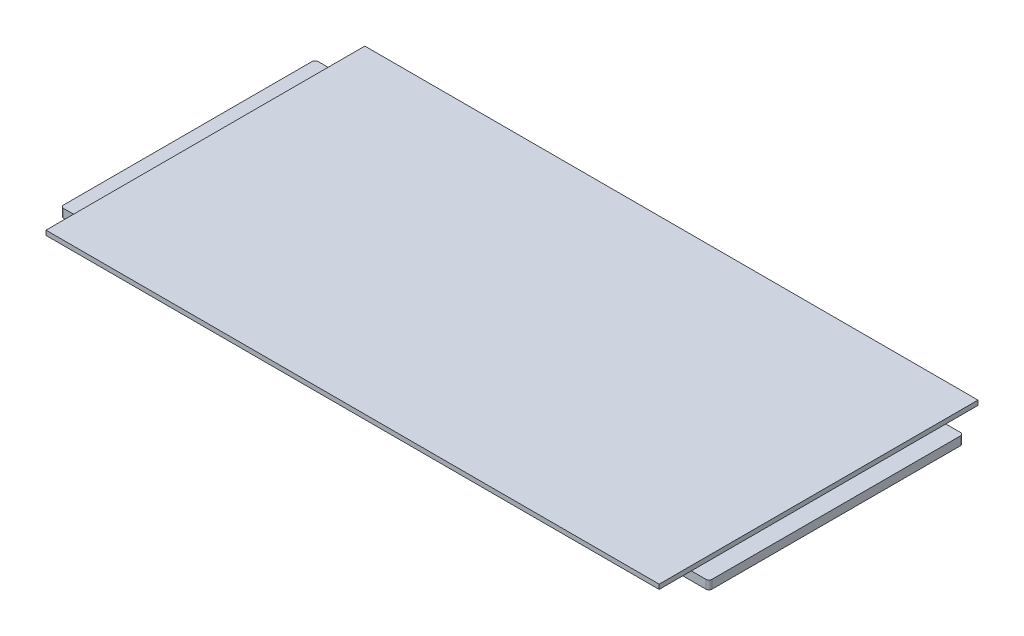
ISO-10303-21;
HEADER;
FILE_DESCRIPTION(('STEP AP214'),'2;1');
FILE_NAME('part.step','',(''),(''),'','','');
FILE_SCHEMA(('AUTOMOTIVE_DESIGN { 1 0 10303 214 1 1 1 1 }'));
ENDSEC;
DATA;
#1=APPLICATION_CONTEXT('core data for automotive mechanical design processes');
#2=APPLICATION_PROTOCOL_DEFINITION('international standard','automotive_design',2000,#1);
#3=PRODUCT_CONTEXT('',#1,'mechanical');
#4=PRODUCT('Part','Part','',(#3));
#5=PRODUCT_RELATED_PRODUCT_CATEGORY('part','',(#4));
#6=PRODUCT_DEFINITION_FORMATION('','',#4);
#7=PRODUCT_DEFINITION_CONTEXT('part definition',#1,'design');
#8=PRODUCT_DEFINITION('design','',#6,#7);
#9=PRODUCT_DEFINITION_SHAPE('','',#8);
#10=(LENGTH_UNIT() NAMED_UNIT(*) SI_UNIT(.MILLI.,.METRE.));
#11=(NAMED_UNIT(*) PLANE_ANGLE_UNIT() SI_UNIT($,.RADIAN.));
#12=(NAMED_UNIT(*) SI_UNIT($,.STERADIAN.) SOLID_ANGLE_UNIT());
#13=UNCERTAINTY_MEASURE_WITH_UNIT(LENGTH_MEASURE(1.E-05),#10,'distance_accuracy_value','');
#14=(GEOMETRIC_REPRESENTATION_CONTEXT(3) GLOBAL_UNCERTAINTY_ASSIGNED_CONTEXT((#13)) GLOBAL_UNIT_ASSIGNED_CONTEXT((#10,
#11,#12)) REPRESENTATION_CONTEXT('',''));
#15=CARTESIAN_POINT('',(0.,0.,0.));
#16=DIRECTION('',(0.,0.,1.));
#17=DIRECTION('',(1.,0.,0.));
#18=AXIS2_PLACEMENT_3D('',#15,#16,#17);
#19=CARTESIAN_POINT('',(0.,17.78,0.));
#20=DIRECTION('',(0.,1.,0.));
#21=DIRECTION('',(0.,0.,1.));
#22=AXIS2_PLACEMENT_3D('',#19,#20,#21);
#23=PLANE('',#22);
#24=DIRECTION('',(0.,0.,-1.));
#25=VECTOR('',#24,1.);
#26=CARTESIAN_POINT('',(635.,17.78,330.2));
#27=LINE('',#26,#25);
#28=CARTESIAN_POINT('',(635.,17.78,263.525));
#29=VERTEX_POINT('',#28);
#30=CARTESIAN_POINT('',(635.,17.78,-263.525));
#31=VERTEX_POINT('',#30);
#32=EDGE_CURVE('E11',#29,#31,#27,.T.);
#33=ORIENTED_EDGE('',*,*,#32,.F.);
#34=DIRECTION('',(1.,0.,0.));
#35=VECTOR('',#34,1.);
#36=CARTESIAN_POINT('',(-671.5125,17.78,263.525));
#37=LINE('',#36,#35);
#38=CARTESIAN_POINT('',(665.1625,17.78,263.525));
#39=VERTEX_POINT('',#38);
#40=EDGE_CURVE('E209',#29,#39,#37,.T.);
#41=ORIENTED_EDGE('',*,*,#40,.T.);
#42=CARTESIAN_POINT('',(665.1625,17.78,257.175));
#43=DIRECTION('',(0.,1.,0.));
#44=DIRECTION('',(0.,0.,1.));
#45=AXIS2_PLACEMENT_3D('',#42,#43,#44);
#46=CIRCLE('',#45,6.35);
#47=CARTESIAN_POINT('',(671.5125,17.78,257.175));
#48=VERTEX_POINT('',#47);
#49=EDGE_CURVE('E242',#39,#48,#46,.T.);
#50=ORIENTED_EDGE('',*,*,#49,.T.);
#51=DIRECTION('',(0.,0.,-1.));
#52=VECTOR('',#51,1.);
#53=CARTESIAN_POINT('',(671.5125,17.78,-263.525));
#54=LINE('',#53,#52);
#55=CARTESIAN_POINT('',(671.5125,17.78,-257.175));
#56=VERTEX_POINT('',#55);
#57=EDGE_CURVE('E199',#48,#56,#54,.T.);
#58=ORIENTED_EDGE('',*,*,#57,.T.);
#59=CARTESIAN_POINT('',(665.1625,17.78,-257.175));
#60=DIRECTION('',(0.,1.,0.));
#61=DIRECTION('',(0.,0.,1.));
#62=AXIS2_PLACEMENT_3D('',#59,#60,#61);
#63=CIRCLE('',#62,6.35);
#64=CARTESIAN_POINT('',(665.1625,17.78,-263.525));
#65=VERTEX_POINT('',#64);
#66=EDGE_CURVE('E244',#56,#65,#63,.T.);
#67=ORIENTED_EDGE('',*,*,#66,.T.);
#68=DIRECTION('',(-1.,0.,0.));
#69=VECTOR('',#68,1.);
#70=CARTESIAN_POINT('',(-671.5125,17.78,-263.525));
#71=LINE('',#70,#69);
#72=EDGE_CURVE('E204',#65,#31,#71,.T.);
#73=ORIENTED_EDGE('',*,*,#72,.T.);
#74=EDGE_LOOP('',(#33,#41,#50,#58,#67,#73));
#75=FACE_BOUND('',#74,.T.);
#76=ADVANCED_FACE('F33',(#75),#23,.T.);
#77=CARTESIAN_POINT('',(671.5125,17.78,-263.525));
#78=DIRECTION('',(-1.,0.,0.));
#79=DIRECTION('',(0.,0.,1.));
#80=AXIS2_PLACEMENT_3D('',#77,#78,#79);
#81=PLANE('',#80);
#82=DIRECTION('',(0.,0.,-1.));
#83=VECTOR('',#82,1.);
#84=CARTESIAN_POINT('',(671.5125,0.,-263.525));
#85=LINE('',#84,#83);
#86=CARTESIAN_POINT('',(671.5125,0.,257.175));
#87=VERTEX_POINT('',#86);
#88=CARTESIAN_POINT('',(671.5125,0.,-257.175));
#89=VERTEX_POINT('',#88);
#90=EDGE_CURVE('E198',#87,#89,#85,.T.);
#91=ORIENTED_EDGE('',*,*,#90,.T.);
#92=DIRECTION('',(0.,-1.,0.));
#93=VECTOR('',#92,1.);
#94=CARTESIAN_POINT('',(671.5125,17.78,-257.175));
#95=LINE('',#94,#93);
#96=EDGE_CURVE('E37',#89,#56,#95,.F.);
#97=ORIENTED_EDGE('',*,*,#96,.T.);
#98=ORIENTED_EDGE('',*,*,#57,.F.);
#99=DIRECTION('',(0.,-1.,0.));
#100=VECTOR('',#99,1.);
#101=CARTESIAN_POINT('',(671.5125,17.78,257.175));
#102=LINE('',#101,#100);
#103=EDGE_CURVE('E255',#48,#87,#102,.T.);
#104=ORIENTED_EDGE('',*,*,#103,.T.);
#105=EDGE_LOOP('',(#91,#97,#98,#104));
#106=FACE_BOUND('',#105,.T.);
#107=ADVANCED_FACE('F298',(#106),#81,.F.);
#108=CARTESIAN_POINT('',(-671.5125,17.78,-263.525));
#109=DIRECTION('',(0.,0.,1.));
#110=DIRECTION('',(1.,0.,0.));
#111=AXIS2_PLACEMENT_3D('',#108,#109,#110);
#112=PLANE('',#111);
#113=DIRECTION('',(-1.,0.,0.));
#114=VECTOR('',#113,1.);
#115=CARTESIAN_POINT('',(-671.5125,0.,-263.525));
#116=LINE('',#115,#114);
#117=CARTESIAN_POINT('',(665.1625,0.,-263.525));
#118=VERTEX_POINT('',#117);
#119=CARTESIAN_POINT('',(-665.1625,0.,-263.525));
#120=VERTEX_POINT('',#119);
#121=EDGE_CURVE('E216',#118,#120,#116,.T.);
#122=ORIENTED_EDGE('',*,*,#121,.T.);
#123=DIRECTION('',(0.,-1.,0.));
#124=VECTOR('',#123,1.);
#125=CARTESIAN_POINT('',(-665.1625,17.78,-263.525));
#126=LINE('',#125,#124);
#127=CARTESIAN_POINT('',(-665.1625,17.78,-263.525));
#128=VERTEX_POINT('',#127);
#129=EDGE_CURVE('E253',#120,#128,#126,.F.);
#130=ORIENTED_EDGE('',*,*,#129,.T.);
#131=CARTESIAN_POINT('',(-635.,17.78,-263.525));
#132=VERTEX_POINT('',#131);
#133=EDGE_CURVE('E202',#132,#128,#71,.T.);
#134=ORIENTED_EDGE('',*,*,#133,.F.);
#135=EDGE_CURVE('E58',#31,#132,#71,.T.);
#136=ORIENTED_EDGE('',*,*,#135,.F.);
#137=ORIENTED_EDGE('',*,*,#72,.F.);
#138=DIRECTION('',(0.,-1.,0.));
#139=VECTOR('',#138,1.);
#140=CARTESIAN_POINT('',(665.1625,17.78,-263.525));
#141=LINE('',#140,#139);
#142=EDGE_CURVE('E250',#65,#118,#141,.T.);
#143=ORIENTED_EDGE('',*,*,#142,.T.);
#144=EDGE_LOOP('',(#122,#130,#134,#136,#137,#143));
#145=FACE_BOUND('',#144,.T.);
#146=ADVANCED_FACE('F303',(#145),#112,.F.);
#147=CARTESIAN_POINT('',(-671.5125,17.78,-263.525));
#148=DIRECTION('',(1.,0.,0.));
#149=DIRECTION('',(0.,0.,-1.));
#150=AXIS2_PLACEMENT_3D('',#147,#148,#149);
#151=PLANE('',#150);
#152=DIRECTION('',(0.,0.,1.));
#153=VECTOR('',#152,1.);
#154=CARTESIAN_POINT('',(-671.5125,0.,-263.525));
#155=LINE('',#154,#153);
#156=CARTESIAN_POINT('',(-671.5125,0.,-257.175));
#157=VERTEX_POINT('',#156);
#158=CARTESIAN_POINT('',(-671.5125,0.,257.175));
#159=VERTEX_POINT('',#158);
#160=EDGE_CURVE('E219',#157,#159,#155,.T.);
#161=ORIENTED_EDGE('',*,*,#160,.T.);
#162=DIRECTION('',(0.,-1.,0.));
#163=VECTOR('',#162,1.);
#164=CARTESIAN_POINT('',(-671.5125,17.78,257.175));
#165=LINE('',#164,#163);
#166=CARTESIAN_POINT('',(-671.5125,17.78,257.175));
#167=VERTEX_POINT('',#166);
#168=EDGE_CURVE('E240',#159,#167,#165,.F.);
#169=ORIENTED_EDGE('',*,*,#168,.T.);
#170=DIRECTION('',(0.,0.,1.));
#171=VECTOR('',#170,1.);
#172=CARTESIAN_POINT('',(-671.5125,17.78,-263.525));
#173=LINE('',#172,#171);
#174=CARTESIAN_POINT('',(-671.5125,17.78,-257.175));
#175=VERTEX_POINT('',#174);
#176=EDGE_CURVE('E206',#175,#167,#173,.T.);
#177=ORIENTED_EDGE('',*,*,#176,.F.);
#178=DIRECTION('',(0.,-1.,0.));
#179=VECTOR('',#178,1.);
#180=CARTESIAN_POINT('',(-671.5125,17.78,-257.175));
#181=LINE('',#180,#179);
#182=EDGE_CURVE('E237',#175,#157,#181,.T.);
#183=ORIENTED_EDGE('',*,*,#182,.T.);
#184=EDGE_LOOP('',(#161,#169,#177,#183));
#185=FACE_BOUND('',#184,.T.);
#186=ADVANCED_FACE('F312',(#185),#151,.F.);
#187=CARTESIAN_POINT('',(-671.5125,17.78,263.525));
#188=DIRECTION('',(0.,0.,-1.));
#189=DIRECTION('',(-1.,0.,0.));
#190=AXIS2_PLACEMENT_3D('',#187,#188,#189);
#191=PLANE('',#190);
#192=CARTESIAN_POINT('',(-665.1625,17.78,263.525));
#193=VERTEX_POINT('',#192);
#194=CARTESIAN_POINT('',(-635.,17.78,263.525));
#195=VERTEX_POINT('',#194);
#196=EDGE_CURVE('E210',#193,#195,#37,.T.);
#197=ORIENTED_EDGE('',*,*,#196,.F.);
#198=DIRECTION('',(0.,-1.,0.));
#199=VECTOR('',#198,1.);
#200=CARTESIAN_POINT('',(-665.1625,17.78,263.525));
#201=LINE('',#200,#199);
#202=CARTESIAN_POINT('',(-665.1625,0.,263.525));
#203=VERTEX_POINT('',#202);
#204=EDGE_CURVE('E226',#193,#203,#201,.T.);
#205=ORIENTED_EDGE('',*,*,#204,.T.);
#206=DIRECTION('',(1.,0.,0.));
#207=VECTOR('',#206,1.);
#208=CARTESIAN_POINT('',(-671.5125,0.,263.525));
#209=LINE('',#208,#207);
#210=CARTESIAN_POINT('',(665.1625,0.,263.525));
#211=VERTEX_POINT('',#210);
#212=EDGE_CURVE('E203',#203,#211,#209,.T.);
#213=ORIENTED_EDGE('',*,*,#212,.T.);
#214=DIRECTION('',(0.,-1.,0.));
#215=VECTOR('',#214,1.);
#216=CARTESIAN_POINT('',(665.1625,17.78,263.525));
#217=LINE('',#216,#215);
#218=EDGE_CURVE('E212',#211,#39,#217,.F.);
#219=ORIENTED_EDGE('',*,*,#218,.T.);
#220=ORIENTED_EDGE('',*,*,#40,.F.);
#221=EDGE_CURVE('E213',#195,#29,#37,.T.);
#222=ORIENTED_EDGE('',*,*,#221,.F.);
#223=EDGE_LOOP('',(#197,#205,#213,#219,#220,#222));
#224=FACE_BOUND('',#223,.T.);
#225=ADVANCED_FACE('F292',(#224),#191,.F.);
#226=DIRECTION('',(0.,0.,1.));
#227=VECTOR('',#226,1.);
#228=CARTESIAN_POINT('',(-635.,17.78,330.2));
#229=LINE('',#228,#227);
#230=EDGE_CURVE('E42',#132,#195,#229,.T.);
#231=ORIENTED_EDGE('',*,*,#230,.F.);
#232=ORIENTED_EDGE('',*,*,#133,.T.);
#233=CARTESIAN_POINT('',(-665.1625,17.78,-257.175));
#234=DIRECTION('',(0.,1.,0.));
#235=DIRECTION('',(0.,0.,1.));
#236=AXIS2_PLACEMENT_3D('',#233,#234,#235);
#237=CIRCLE('',#236,6.35);
#238=EDGE_CURVE('E246',#128,#175,#237,.T.);
#239=ORIENTED_EDGE('',*,*,#238,.T.);
#240=ORIENTED_EDGE('',*,*,#176,.T.);
#241=CARTESIAN_POINT('',(-665.1625,17.78,257.175));
#242=DIRECTION('',(0.,1.,0.));
#243=DIRECTION('',(0.,0.,1.));
#244=AXIS2_PLACEMENT_3D('',#241,#242,#243);
#245=CIRCLE('',#244,6.35);
#246=EDGE_CURVE('E248',#167,#193,#245,.T.);
#247=ORIENTED_EDGE('',*,*,#246,.T.);
#248=ORIENTED_EDGE('',*,*,#196,.T.);
#249=EDGE_LOOP('',(#231,#232,#239,#240,#247,#248));
#250=FACE_BOUND('',#249,.T.);
#251=ADVANCED_FACE('F315',(#250),#23,.T.);
#252=CARTESIAN_POINT('',(0.,0.,0.));
#253=DIRECTION('',(0.,1.,0.));
#254=DIRECTION('',(0.,0.,1.));
#255=AXIS2_PLACEMENT_3D('',#252,#253,#254);
#256=PLANE('',#255);
#257=CARTESIAN_POINT('',(0.,0.,0.));
#258=DIRECTION('',(0.,1.,0.));
#259=DIRECTION('',(0.,0.,1.));
#260=AXIS2_PLACEMENT_3D('',#257,#258,#259);
#261=CIRCLE('',#260,1.5875);
#262=CARTESIAN_POINT('',(0.,0.,1.5875));
#263=VERTEX_POINT('',#262);
#264=EDGE_CURVE('E175',#263,#263,#261,.T.);
#265=ORIENTED_EDGE('',*,*,#264,.T.);
#266=EDGE_LOOP('',(#265));
#267=FACE_BOUND('',#266,.T.);
#268=CARTESIAN_POINT('',(457.2,0.,-152.4));
#269=DIRECTION('',(0.,1.,0.));
#270=DIRECTION('',(0.,0.,1.));
#271=AXIS2_PLACEMENT_3D('',#268,#269,#270);
#272=CIRCLE('',#271,1.58750000000002);
#273=CARTESIAN_POINT('',(457.2,0.,-150.8125));
#274=VERTEX_POINT('',#273);
#275=EDGE_CURVE('E179',#274,#274,#272,.T.);
#276=ORIENTED_EDGE('',*,*,#275,.T.);
#277=EDGE_LOOP('',(#276));
#278=FACE_BOUND('',#277,.T.);
#279=CARTESIAN_POINT('',(-457.2,0.,152.4));
#280=DIRECTION('',(0.,1.,0.));
#281=DIRECTION('',(0.,0.,1.));
#282=AXIS2_PLACEMENT_3D('',#279,#280,#281);
#283=CIRCLE('',#282,1.58750000000002);
#284=CARTESIAN_POINT('',(-457.2,0.,153.9875));
#285=VERTEX_POINT('',#284);
#286=EDGE_CURVE('E185',#285,#285,#283,.T.);
#287=ORIENTED_EDGE('',*,*,#286,.T.);
#288=EDGE_LOOP('',(#287));
#289=FACE_BOUND('',#288,.T.);
#290=CARTESIAN_POINT('',(-457.2,0.,-152.4));
#291=DIRECTION('',(0.,1.,0.));
#292=DIRECTION('',(0.,0.,1.));
#293=AXIS2_PLACEMENT_3D('',#290,#291,#292);
#294=CIRCLE('',#293,1.58750000000002);
#295=CARTESIAN_POINT('',(-457.2,0.,-150.8125));
#296=VERTEX_POINT('',#295);
#297=EDGE_CURVE('E190',#296,#296,#294,.T.);
#298=ORIENTED_EDGE('',*,*,#297,.T.);
#299=EDGE_LOOP('',(#298));
#300=FACE_BOUND('',#299,.T.);
#301=CARTESIAN_POINT('',(457.2,0.,152.4));
#302=DIRECTION('',(0.,1.,0.));
#303=DIRECTION('',(0.,0.,1.));
#304=AXIS2_PLACEMENT_3D('',#301,#302,#303);
#305=CIRCLE('',#304,1.58750000000002);
#306=CARTESIAN_POINT('',(457.2,0.,153.9875));
#307=VERTEX_POINT('',#306);
#308=EDGE_CURVE('E194',#307,#307,#305,.T.);
#309=ORIENTED_EDGE('',*,*,#308,.T.);
#310=EDGE_LOOP('',(#309));
#311=FACE_BOUND('',#310,.T.);
#312=ORIENTED_EDGE('',*,*,#212,.F.);
#313=CARTESIAN_POINT('',(-665.1625,0.,257.175));
#314=DIRECTION('',(0.,1.,0.));
#315=DIRECTION('',(0.,0.,1.));
#316=AXIS2_PLACEMENT_3D('',#313,#314,#315);
#317=CIRCLE('',#316,6.35);
#318=EDGE_CURVE('E235',#203,#159,#317,.F.);
#319=ORIENTED_EDGE('',*,*,#318,.T.);
#320=ORIENTED_EDGE('',*,*,#160,.F.);
#321=CARTESIAN_POINT('',(-665.1625,0.,-257.175));
#322=DIRECTION('',(0.,1.,0.));
#323=DIRECTION('',(0.,0.,1.));
#324=AXIS2_PLACEMENT_3D('',#321,#322,#323);
#325=CIRCLE('',#324,6.35);
#326=EDGE_CURVE('E233',#157,#120,#325,.F.);
#327=ORIENTED_EDGE('',*,*,#326,.T.);
#328=ORIENTED_EDGE('',*,*,#121,.F.);
#329=CARTESIAN_POINT('',(665.1625,0.,-257.175));
#330=DIRECTION('',(0.,1.,0.));
#331=DIRECTION('',(0.,0.,1.));
#332=AXIS2_PLACEMENT_3D('',#329,#330,#331);
#333=CIRCLE('',#332,6.35);
#334=EDGE_CURVE('E231',#118,#89,#333,.F.);
#335=ORIENTED_EDGE('',*,*,#334,.T.);
#336=ORIENTED_EDGE('',*,*,#90,.F.);
#337=CARTESIAN_POINT('',(665.1625,0.,257.175));
#338=DIRECTION('',(0.,1.,0.));
#339=DIRECTION('',(0.,0.,1.));
#340=AXIS2_PLACEMENT_3D('',#337,#338,#339);
#341=CIRCLE('',#340,6.35);
#342=EDGE_CURVE('E229',#87,#211,#341,.F.);
#343=ORIENTED_EDGE('',*,*,#342,.T.);
#344=EDGE_LOOP('',(#312,#319,#320,#327,#328,#335,#336,#343));
#345=FACE_BOUND('',#344,.T.);
#346=ADVANCED_FACE('F296',(#267,#278,#289,#300,#311,#345),#256,.F.);
#347=CARTESIAN_POINT('',(-665.1625,17.78,257.175));
#348=DIRECTION('',(0.,-1.,0.));
#349=DIRECTION('',(0.,0.,-1.));
#350=AXIS2_PLACEMENT_3D('',#347,#348,#349);
#351=CYLINDRICAL_SURFACE('',#350,6.35);
#352=ORIENTED_EDGE('',*,*,#246,.F.);
#353=ORIENTED_EDGE('',*,*,#168,.F.);
#354=ORIENTED_EDGE('',*,*,#318,.F.);
#355=ORIENTED_EDGE('',*,*,#204,.F.);
#356=EDGE_LOOP('',(#352,#353,#354,#355));
#357=FACE_BOUND('',#356,.T.);
#358=ADVANCED_FACE('F318',(#357),#351,.T.);
#359=CARTESIAN_POINT('',(-665.1625,17.78,-257.175));
#360=DIRECTION('',(0.,-1.,0.));
#361=DIRECTION('',(0.,0.,-1.));
#362=AXIS2_PLACEMENT_3D('',#359,#360,#361);
#363=CYLINDRICAL_SURFACE('',#362,6.35);
#364=ORIENTED_EDGE('',*,*,#238,.F.);
#365=ORIENTED_EDGE('',*,*,#129,.F.);
#366=ORIENTED_EDGE('',*,*,#326,.F.);
#367=ORIENTED_EDGE('',*,*,#182,.F.);
#368=EDGE_LOOP('',(#364,#365,#366,#367));
#369=FACE_BOUND('',#368,.T.);
#370=ADVANCED_FACE('F309',(#369),#363,.T.);
#371=CARTESIAN_POINT('',(665.1625,17.78,-257.175));
#372=DIRECTION('',(0.,-1.,0.));
#373=DIRECTION('',(0.,0.,-1.));
#374=AXIS2_PLACEMENT_3D('',#371,#372,#373);
#375=CYLINDRICAL_SURFACE('',#374,6.35);
#376=ORIENTED_EDGE('',*,*,#66,.F.);
#377=ORIENTED_EDGE('',*,*,#96,.F.);
#378=ORIENTED_EDGE('',*,*,#334,.F.);
#379=ORIENTED_EDGE('',*,*,#142,.F.);
#380=EDGE_LOOP('',(#376,#377,#378,#379));
#381=FACE_BOUND('',#380,.T.);
#382=ADVANCED_FACE('F301',(#381),#375,.T.);
#383=CARTESIAN_POINT('',(665.1625,17.78,257.175));
#384=DIRECTION('',(0.,-1.,0.));
#385=DIRECTION('',(0.,0.,-1.));
#386=AXIS2_PLACEMENT_3D('',#383,#384,#385);
#387=CYLINDRICAL_SURFACE('',#386,6.35);
#388=ORIENTED_EDGE('',*,*,#49,.F.);
#389=ORIENTED_EDGE('',*,*,#218,.F.);
#390=ORIENTED_EDGE('',*,*,#342,.F.);
#391=ORIENTED_EDGE('',*,*,#103,.F.);
#392=EDGE_LOOP('',(#388,#389,#390,#391));
#393=FACE_BOUND('',#392,.T.);
#394=ADVANCED_FACE('F35',(#393),#387,.T.);
#395=CARTESIAN_POINT('',(457.2,17.78,152.4));
#396=DIRECTION('',(0.,1.,0.));
#397=DIRECTION('',(0.,0.,1.));
#398=AXIS2_PLACEMENT_3D('',#395,#396,#397);
#399=CYLINDRICAL_SURFACE('',#398,1.58750000000002);
#400=ORIENTED_EDGE('',*,*,#308,.F.);
#401=EDGE_LOOP('',(#400));
#402=FACE_BOUND('',#401,.T.);
#403=CARTESIAN_POINT('',(457.2,17.78,152.4));
#404=DIRECTION('',(0.,1.,0.));
#405=DIRECTION('',(0.,0.,1.));
#406=AXIS2_PLACEMENT_3D('',#403,#404,#405);
#407=CIRCLE('',#406,1.58750000000002);
#408=CARTESIAN_POINT('',(457.2,17.78,153.9875));
#409=VERTEX_POINT('',#408);
#410=EDGE_CURVE('E163',#409,#409,#407,.T.);
#411=ORIENTED_EDGE('',*,*,#410,.T.);
#412=EDGE_LOOP('',(#411));
#413=FACE_BOUND('',#412,.T.);
#414=ADVANCED_FACE('F384',(#402,#413),#399,.F.);
#415=CARTESIAN_POINT('',(-457.2,17.78,-152.4));
#416=DIRECTION('',(0.,1.,0.));
#417=DIRECTION('',(0.,0.,1.));
#418=AXIS2_PLACEMENT_3D('',#415,#416,#417);
#419=CYLINDRICAL_SURFACE('',#418,1.58750000000002);
#420=ORIENTED_EDGE('',*,*,#297,.F.);
#421=EDGE_LOOP('',(#420));
#422=FACE_BOUND('',#421,.T.);
#423=CARTESIAN_POINT('',(-457.2,17.78,-152.4));
#424=DIRECTION('',(0.,1.,0.));
#425=DIRECTION('',(0.,0.,1.));
#426=AXIS2_PLACEMENT_3D('',#423,#424,#425);
#427=CIRCLE('',#426,1.58750000000002);
#428=CARTESIAN_POINT('',(-457.2,17.78,-150.8125));
#429=VERTEX_POINT('',#428);
#430=EDGE_CURVE('E166',#429,#429,#427,.T.);
#431=ORIENTED_EDGE('',*,*,#430,.T.);
#432=EDGE_LOOP('',(#431));
#433=FACE_BOUND('',#432,.T.);
#434=ADVANCED_FACE('F398',(#422,#433),#419,.F.);
#435=CARTESIAN_POINT('',(-457.2,17.78,152.4));
#436=DIRECTION('',(0.,1.,0.));
#437=DIRECTION('',(0.,0.,1.));
#438=AXIS2_PLACEMENT_3D('',#435,#436,#437);
#439=CYLINDRICAL_SURFACE('',#438,1.58750000000002);
#440=ORIENTED_EDGE('',*,*,#286,.F.);
#441=EDGE_LOOP('',(#440));
#442=FACE_BOUND('',#441,.T.);
#443=CARTESIAN_POINT('',(-457.2,17.78,152.4));
#444=DIRECTION('',(0.,1.,0.));
#445=DIRECTION('',(0.,0.,1.));
#446=AXIS2_PLACEMENT_3D('',#443,#444,#445);
#447=CIRCLE('',#446,1.58750000000002);
#448=CARTESIAN_POINT('',(-457.2,17.78,153.9875));
#449=VERTEX_POINT('',#448);
#450=EDGE_CURVE('E182',#449,#449,#447,.T.);
#451=ORIENTED_EDGE('',*,*,#450,.T.);
#452=EDGE_LOOP('',(#451));
#453=FACE_BOUND('',#452,.T.);
#454=ADVANCED_FACE('F407',(#442,#453),#439,.F.);
#455=CARTESIAN_POINT('',(457.2,17.78,-152.4));
#456=DIRECTION('',(0.,1.,0.));
#457=DIRECTION('',(0.,0.,1.));
#458=AXIS2_PLACEMENT_3D('',#455,#456,#457);
#459=CYLINDRICAL_SURFACE('',#458,1.58750000000002);
#460=ORIENTED_EDGE('',*,*,#275,.F.);
#461=EDGE_LOOP('',(#460));
#462=FACE_BOUND('',#461,.T.);
#463=CARTESIAN_POINT('',(457.2,17.78,-152.4));
#464=DIRECTION('',(0.,1.,0.));
#465=DIRECTION('',(0.,0.,1.));
#466=AXIS2_PLACEMENT_3D('',#463,#464,#465);
#467=CIRCLE('',#466,1.58750000000002);
#468=CARTESIAN_POINT('',(457.2,17.78,-150.8125));
#469=VERTEX_POINT('',#468);
#470=EDGE_CURVE('E176',#469,#469,#467,.T.);
#471=ORIENTED_EDGE('',*,*,#470,.T.);
#472=EDGE_LOOP('',(#471));
#473=FACE_BOUND('',#472,.T.);
#474=ADVANCED_FACE('F417',(#462,#473),#459,.F.);
#475=CARTESIAN_POINT('',(0.,17.78,0.));
#476=DIRECTION('',(0.,1.,0.));
#477=DIRECTION('',(0.,0.,1.));
#478=AXIS2_PLACEMENT_3D('',#475,#476,#477);
#479=CYLINDRICAL_SURFACE('',#478,1.5875);
#480=ORIENTED_EDGE('',*,*,#264,.F.);
#481=EDGE_LOOP('',(#480));
#482=FACE_BOUND('',#481,.T.);
#483=CARTESIAN_POINT('',(0.,17.78,0.));
#484=DIRECTION('',(0.,1.,0.));
#485=DIRECTION('',(0.,0.,1.));
#486=AXIS2_PLACEMENT_3D('',#483,#484,#485);
#487=CIRCLE('',#486,1.5875);
#488=CARTESIAN_POINT('',(0.,17.78,1.5875));
#489=VERTEX_POINT('',#488);
#490=EDGE_CURVE('E172',#489,#489,#487,.T.);
#491=ORIENTED_EDGE('',*,*,#490,.T.);
#492=EDGE_LOOP('',(#491));
#493=FACE_BOUND('',#492,.T.);
#494=ADVANCED_FACE('F427',(#482,#493),#479,.F.);
#495=CARTESIAN_POINT('',(0.,17.78,0.));
#496=DIRECTION('',(0.,-1.,0.));
#497=DIRECTION('',(0.,0.,-1.));
#498=AXIS2_PLACEMENT_3D('',#495,#496,#497);
#499=PLANE('',#498);
#500=CARTESIAN_POINT('',(635.,17.78,-330.2));
#501=VERTEX_POINT('',#500);
#502=EDGE_CURVE('E45',#31,#501,#27,.T.);
#503=ORIENTED_EDGE('',*,*,#502,.F.);
#504=ORIENTED_EDGE('',*,*,#135,.T.);
#505=CARTESIAN_POINT('',(-635.,17.78,-330.2));
#506=VERTEX_POINT('',#505);
#507=EDGE_CURVE('E263',#506,#132,#229,.T.);
#508=ORIENTED_EDGE('',*,*,#507,.F.);
#509=DIRECTION('',(-1.,0.,0.));
#510=VECTOR('',#509,1.);
#511=CARTESIAN_POINT('',(-635.,17.78,-330.2));
#512=LINE('',#511,#510);
#513=EDGE_CURVE('E269',#501,#506,#512,.T.);
#514=ORIENTED_EDGE('',*,*,#513,.F.);
#515=EDGE_LOOP('',(#503,#504,#508,#514));
#516=FACE_BOUND('',#515,.T.);
#517=ADVANCED_FACE('F436',(#516),#499,.T.);
#518=CARTESIAN_POINT('',(0.,27.305,0.));
#519=DIRECTION('',(0.,-1.,0.));
#520=DIRECTION('',(0.,0.,-1.));
#521=AXIS2_PLACEMENT_3D('',#518,#519,#520);
#522=PLANE('',#521);
#523=DIRECTION('',(0.,0.,-1.));
#524=VECTOR('',#523,1.);
#525=CARTESIAN_POINT('',(635.,27.305,330.2));
#526=LINE('',#525,#524);
#527=CARTESIAN_POINT('',(635.,27.305,330.2));
#528=VERTEX_POINT('',#527);
#529=CARTESIAN_POINT('',(635.,27.305,-330.2));
#530=VERTEX_POINT('',#529);
#531=EDGE_CURVE('E148',#528,#530,#526,.T.);
#532=ORIENTED_EDGE('',*,*,#531,.T.);
#533=DIRECTION('',(-1.,0.,0.));
#534=VECTOR('',#533,1.);
#535=CARTESIAN_POINT('',(-635.,27.305,-330.2));
#536=LINE('',#535,#534);
#537=CARTESIAN_POINT('',(-635.,27.305,-330.2));
#538=VERTEX_POINT('',#537);
#539=EDGE_CURVE('E138',#530,#538,#536,.T.);
#540=ORIENTED_EDGE('',*,*,#539,.T.);
#541=DIRECTION('',(0.,0.,1.));
#542=VECTOR('',#541,1.);
#543=CARTESIAN_POINT('',(-635.,27.305,330.2));
#544=LINE('',#543,#542);
#545=CARTESIAN_POINT('',(-635.,27.305,330.2));
#546=VERTEX_POINT('',#545);
#547=EDGE_CURVE('E147',#538,#546,#544,.T.);
#548=ORIENTED_EDGE('',*,*,#547,.T.);
#549=DIRECTION('',(1.,0.,0.));
#550=VECTOR('',#549,1.);
#551=CARTESIAN_POINT('',(-635.,27.305,330.2));
#552=LINE('',#551,#550);
#553=EDGE_CURVE('E153',#546,#528,#552,.T.);
#554=ORIENTED_EDGE('',*,*,#553,.T.);
#555=EDGE_LOOP('',(#532,#540,#548,#554));
#556=FACE_BOUND('',#555,.T.);
#557=ADVANCED_FACE('F151',(#556),#522,.F.);
#558=CARTESIAN_POINT('',(-635.,27.305,330.2));
#559=DIRECTION('',(0.,0.,-1.));
#560=DIRECTION('',(-1.,0.,0.));
#561=AXIS2_PLACEMENT_3D('',#558,#559,#560);
#562=PLANE('',#561);
#563=DIRECTION('',(1.,0.,0.));
#564=VECTOR('',#563,1.);
#565=CARTESIAN_POINT('',(-635.,17.78,330.2));
#566=LINE('',#565,#564);
#567=CARTESIAN_POINT('',(-635.,17.78,330.2));
#568=VERTEX_POINT('',#567);
#569=CARTESIAN_POINT('',(635.,17.78,330.2));
#570=VERTEX_POINT('',#569);
#571=EDGE_CURVE('E157',#568,#570,#566,.T.);
#572=ORIENTED_EDGE('',*,*,#571,.T.);
#573=DIRECTION('',(0.,-1.,0.));
#574=VECTOR('',#573,1.);
#575=CARTESIAN_POINT('',(635.,27.305,330.2));
#576=LINE('',#575,#574);
#577=EDGE_CURVE('E275',#528,#570,#576,.T.);
#578=ORIENTED_EDGE('',*,*,#577,.F.);
#579=ORIENTED_EDGE('',*,*,#553,.F.);
#580=DIRECTION('',(0.,-1.,0.));
#581=VECTOR('',#580,1.);
#582=CARTESIAN_POINT('',(-635.,27.305,330.2));
#583=LINE('',#582,#581);
#584=EDGE_CURVE('E168',#546,#568,#583,.T.);
#585=ORIENTED_EDGE('',*,*,#584,.T.);
#586=EDGE_LOOP('',(#572,#578,#579,#585));
#587=FACE_BOUND('',#586,.T.);
#588=ADVANCED_FACE('F279',(#587),#562,.F.);
#589=CARTESIAN_POINT('',(-635.,27.305,330.2));
#590=DIRECTION('',(1.,0.,0.));
#591=DIRECTION('',(0.,0.,-1.));
#592=AXIS2_PLACEMENT_3D('',#589,#590,#591);
#593=PLANE('',#592);
#594=ORIENTED_EDGE('',*,*,#507,.T.);
#595=ORIENTED_EDGE('',*,*,#230,.T.);
#596=EDGE_CURVE('E264',#195,#568,#229,.T.);
#597=ORIENTED_EDGE('',*,*,#596,.T.);
#598=ORIENTED_EDGE('',*,*,#584,.F.);
#599=ORIENTED_EDGE('',*,*,#547,.F.);
#600=DIRECTION('',(0.,-1.,0.));
#601=VECTOR('',#600,1.);
#602=CARTESIAN_POINT('',(-635.,27.305,-330.2));
#603=LINE('',#602,#601);
#604=EDGE_CURVE('E144',#538,#506,#603,.T.);
#605=ORIENTED_EDGE('',*,*,#604,.T.);
#606=EDGE_LOOP('',(#594,#595,#597,#598,#599,#605));
#607=FACE_BOUND('',#606,.T.);
#608=ADVANCED_FACE('F276',(#607),#593,.F.);
#609=CARTESIAN_POINT('',(-635.,27.305,-330.2));
#610=DIRECTION('',(0.,0.,1.));
#611=DIRECTION('',(1.,0.,0.));
#612=AXIS2_PLACEMENT_3D('',#609,#610,#611);
#613=PLANE('',#612);
#614=ORIENTED_EDGE('',*,*,#513,.T.);
#615=ORIENTED_EDGE('',*,*,#604,.F.);
#616=ORIENTED_EDGE('',*,*,#539,.F.);
#617=DIRECTION('',(0.,-1.,0.));
#618=VECTOR('',#617,1.);
#619=CARTESIAN_POINT('',(635.,27.305,-330.2));
#620=LINE('',#619,#618);
#621=EDGE_CURVE('E142',#530,#501,#620,.T.);
#622=ORIENTED_EDGE('',*,*,#621,.T.);
#623=EDGE_LOOP('',(#614,#615,#616,#622));
#624=FACE_BOUND('',#623,.T.);
#625=ADVANCED_FACE('F140',(#624),#613,.F.);
#626=CARTESIAN_POINT('',(635.,27.305,330.2));
#627=DIRECTION('',(-1.,0.,0.));
#628=DIRECTION('',(0.,0.,1.));
#629=AXIS2_PLACEMENT_3D('',#626,#627,#628);
#630=PLANE('',#629);
#631=EDGE_CURVE('E44',#570,#29,#27,.T.);
#632=ORIENTED_EDGE('',*,*,#631,.T.);
#633=ORIENTED_EDGE('',*,*,#32,.T.);
#634=ORIENTED_EDGE('',*,*,#502,.T.);
#635=ORIENTED_EDGE('',*,*,#621,.F.);
#636=ORIENTED_EDGE('',*,*,#531,.F.);
#637=ORIENTED_EDGE('',*,*,#577,.T.);
#638=EDGE_LOOP('',(#632,#633,#634,#635,#636,#637));
#639=FACE_BOUND('',#638,.T.);
#640=ADVANCED_FACE('F160',(#639),#630,.F.);
#641=ORIENTED_EDGE('',*,*,#596,.F.);
#642=ORIENTED_EDGE('',*,*,#221,.T.);
#643=ORIENTED_EDGE('',*,*,#631,.F.);
#644=ORIENTED_EDGE('',*,*,#571,.F.);
#645=EDGE_LOOP('',(#641,#642,#643,#644));
#646=FACE_BOUND('',#645,.T.);
#647=ADVANCED_FACE('F284',(#646),#499,.T.);
#648=ORIENTED_EDGE('',*,*,#410,.F.);
#649=EDGE_LOOP('',(#648));
#650=FACE_BOUND('',#649,.T.);
#651=ADVANCED_FACE('F496',(#650),#499,.T.);
#652=ORIENTED_EDGE('',*,*,#430,.F.);
#653=EDGE_LOOP('',(#652));
#654=FACE_BOUND('',#653,.T.);
#655=ADVANCED_FACE('F503',(#654),#499,.T.);
#656=ORIENTED_EDGE('',*,*,#450,.F.);
#657=EDGE_LOOP('',(#656));
#658=FACE_BOUND('',#657,.T.);
#659=ADVANCED_FACE('F511',(#658),#499,.T.);
#660=ORIENTED_EDGE('',*,*,#470,.F.);
#661=EDGE_LOOP('',(#660));
#662=FACE_BOUND('',#661,.T.);
#663=ADVANCED_FACE('F519',(#662),#499,.T.);
#664=ORIENTED_EDGE('',*,*,#490,.F.);
#665=EDGE_LOOP('',(#664));
#666=FACE_BOUND('',#665,.T.);
#667=ADVANCED_FACE('F454',(#666),#499,.T.);
#668=CLOSED_SHELL('',(#76,#107,#146,#186,#225,#251,#346,#358,#370,#382,#394,#414,#434,#454,#474,
#494,#517,#557,#588,#608,#625,#640,#647,#651,#655,#659,#663,#667));
#669=MANIFOLD_SOLID_BREP('B2',#668);
#670=ADVANCED_BREP_SHAPE_REPRESENTATION('',(#18,#669),#14);
#671=SHAPE_DEFINITION_REPRESENTATION(#9,#670);
ENDSEC;
END-ISO-10303-21;
